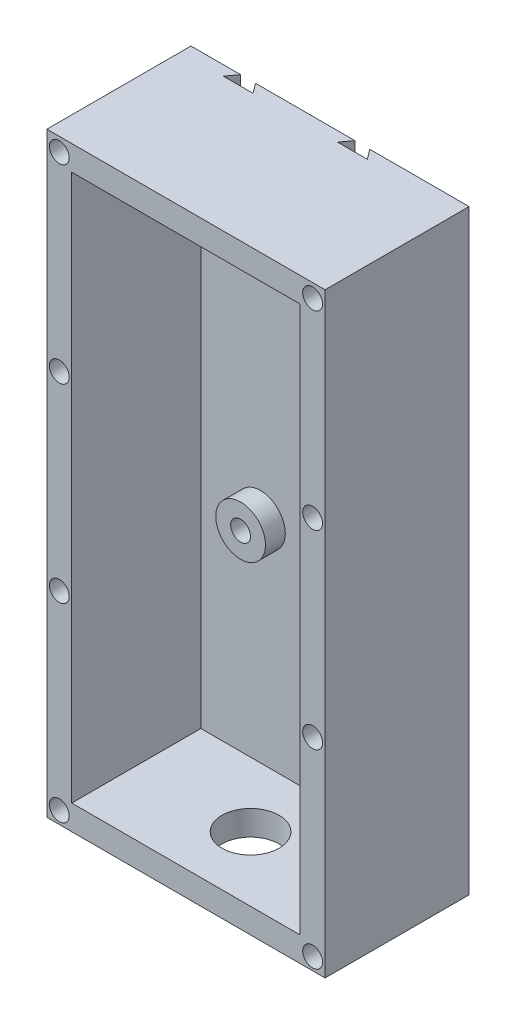
ISO-10303-21;
HEADER;
FILE_DESCRIPTION(('STEP AP214'),'2;1');
FILE_NAME('part.step','',(''),(''),'','','');
FILE_SCHEMA(('AUTOMOTIVE_DESIGN { 1 0 10303 214 1 1 1 1 }'));
ENDSEC;
DATA;
#1=APPLICATION_CONTEXT('core data for automotive mechanical design processes');
#2=APPLICATION_PROTOCOL_DEFINITION('international standard','automotive_design',2000,#1);
#3=PRODUCT_CONTEXT('',#1,'mechanical');
#4=PRODUCT('Part','Part','',(#3));
#5=PRODUCT_RELATED_PRODUCT_CATEGORY('part','',(#4));
#6=PRODUCT_DEFINITION_FORMATION('','',#4);
#7=PRODUCT_DEFINITION_CONTEXT('part definition',#1,'design');
#8=PRODUCT_DEFINITION('design','',#6,#7);
#9=PRODUCT_DEFINITION_SHAPE('','',#8);
#10=(LENGTH_UNIT() NAMED_UNIT(*) SI_UNIT(.MILLI.,.METRE.));
#11=(NAMED_UNIT(*) PLANE_ANGLE_UNIT() SI_UNIT($,.RADIAN.));
#12=(NAMED_UNIT(*) SI_UNIT($,.STERADIAN.) SOLID_ANGLE_UNIT());
#13=UNCERTAINTY_MEASURE_WITH_UNIT(LENGTH_MEASURE(1.E-05),#10,'distance_accuracy_value','');
#14=(GEOMETRIC_REPRESENTATION_CONTEXT(3) GLOBAL_UNCERTAINTY_ASSIGNED_CONTEXT((#13)) GLOBAL_UNIT_ASSIGNED_CONTEXT((#10,
#11,#12)) REPRESENTATION_CONTEXT('',''));
#15=CARTESIAN_POINT('',(0.,0.,0.));
#16=DIRECTION('',(0.,0.,1.));
#17=DIRECTION('',(1.,0.,0.));
#18=AXIS2_PLACEMENT_3D('',#15,#16,#17);
#19=CARTESIAN_POINT('',(0.,0.,0.));
#20=DIRECTION('',(0.,0.,1.));
#21=DIRECTION('',(1.,0.,0.));
#22=AXIS2_PLACEMENT_3D('',#19,#20,#21);
#23=PLANE('',#22);
#24=DIRECTION('',(1.,0.,0.));
#25=VECTOR('',#24,1.);
#26=CARTESIAN_POINT('',(-114.,-13.,0.));
#27=LINE('',#26,#25);
#28=CARTESIAN_POINT('',(-101.,-13.,0.));
#29=VERTEX_POINT('',#28);
#30=CARTESIAN_POINT('',(-81.,-13.,0.));
#31=VERTEX_POINT('',#30);
#32=EDGE_CURVE('E169',#29,#31,#27,.T.);
#33=ORIENTED_EDGE('',*,*,#32,.F.);
#34=DIRECTION('',(0.,1.,0.));
#35=VECTOR('',#34,1.);
#36=CARTESIAN_POINT('',(-101.,-13.,0.));
#37=LINE('',#36,#35);
#38=CARTESIAN_POINT('',(-101.,107.,0.));
#39=VERTEX_POINT('',#38);
#40=EDGE_CURVE('E276',#29,#39,#37,.T.);
#41=ORIENTED_EDGE('',*,*,#40,.T.);
#42=DIRECTION('',(-1.,0.,0.));
#43=VECTOR('',#42,1.);
#44=CARTESIAN_POINT('',(-114.,107.,0.));
#45=LINE('',#44,#43);
#46=CARTESIAN_POINT('',(-81.,107.,0.));
#47=VERTEX_POINT('',#46);
#48=EDGE_CURVE('E349',#47,#39,#45,.T.);
#49=ORIENTED_EDGE('',*,*,#48,.F.);
#50=DIRECTION('',(0.,1.,0.));
#51=VECTOR('',#50,1.);
#52=CARTESIAN_POINT('',(-81.,-13.,0.));
#53=LINE('',#52,#51);
#54=EDGE_CURVE('E55',#31,#47,#53,.T.);
#55=ORIENTED_EDGE('',*,*,#54,.F.);
#56=EDGE_LOOP('',(#33,#41,#49,#55));
#57=FACE_BOUND('',#56,.T.);
#58=ADVANCED_FACE('F32',(#57),#23,.F.);
#59=CARTESIAN_POINT('',(-78.,-13.,0.));
#60=VERTEX_POINT('',#59);
#61=CARTESIAN_POINT('',(-58.,-13.,0.));
#62=VERTEX_POINT('',#61);
#63=EDGE_CURVE('E171',#60,#62,#27,.T.);
#64=ORIENTED_EDGE('',*,*,#63,.F.);
#65=DIRECTION('',(0.,1.,0.));
#66=VECTOR('',#65,1.);
#67=CARTESIAN_POINT('',(-78.,-13.,0.));
#68=LINE('',#67,#66);
#69=CARTESIAN_POINT('',(-78.,107.,0.));
#70=VERTEX_POINT('',#69);
#71=EDGE_CURVE('E152',#60,#70,#68,.T.);
#72=ORIENTED_EDGE('',*,*,#71,.T.);
#73=CARTESIAN_POINT('',(-58.,107.,0.));
#74=VERTEX_POINT('',#73);
#75=EDGE_CURVE('E354',#74,#70,#45,.T.);
#76=ORIENTED_EDGE('',*,*,#75,.F.);
#77=DIRECTION('',(0.,1.,0.));
#78=VECTOR('',#77,1.);
#79=CARTESIAN_POINT('',(-58.,107.,0.));
#80=LINE('',#79,#78);
#81=EDGE_CURVE('E168',#62,#74,#80,.T.);
#82=ORIENTED_EDGE('',*,*,#81,.F.);
#83=EDGE_LOOP('',(#64,#72,#76,#82));
#84=FACE_BOUND('',#83,.T.);
#85=ADVANCED_FACE('F396',(#84),#23,.F.);
#86=CARTESIAN_POINT('',(0.,0.,3.));
#87=DIRECTION('',(0.,0.,1.));
#88=DIRECTION('',(1.,0.,0.));
#89=AXIS2_PLACEMENT_3D('',#86,#87,#88);
#90=PLANE('',#89);
#91=CARTESIAN_POINT('',(-75.,87.5,3.));
#92=DIRECTION('',(0.,0.,1.));
#93=DIRECTION('',(-1.,0.,0.));
#94=AXIS2_PLACEMENT_3D('',#91,#92,#93);
#95=CIRCLE('',#94,5.00000000000001);
#96=CARTESIAN_POINT('',(-80.,87.5,3.));
#97=VERTEX_POINT('',#96);
#98=EDGE_CURVE('E257',#97,#97,#95,.T.);
#99=ORIENTED_EDGE('',*,*,#98,.F.);
#100=EDGE_LOOP('',(#99));
#101=FACE_BOUND('',#100,.T.);
#102=CARTESIAN_POINT('',(-75.,34.5,3.));
#103=DIRECTION('',(0.,0.,1.));
#104=DIRECTION('',(-1.,0.,0.));
#105=AXIS2_PLACEMENT_3D('',#102,#103,#104);
#106=CIRCLE('',#105,5.00000000000001);
#107=CARTESIAN_POINT('',(-80.,34.5,3.));
#108=VERTEX_POINT('',#107);
#109=EDGE_CURVE('E248',#108,#108,#106,.T.);
#110=ORIENTED_EDGE('',*,*,#109,.F.);
#111=EDGE_LOOP('',(#110));
#112=FACE_BOUND('',#111,.T.);
#113=CARTESIAN_POINT('',(-97.,34.5,3.));
#114=DIRECTION('',(0.,0.,1.));
#115=DIRECTION('',(1.,0.,0.));
#116=AXIS2_PLACEMENT_3D('',#113,#114,#115);
#117=CIRCLE('',#116,5.00000000000001);
#118=CARTESIAN_POINT('',(-92.,34.5,3.));
#119=VERTEX_POINT('',#118);
#120=EDGE_CURVE('E239',#119,#119,#117,.T.);
#121=ORIENTED_EDGE('',*,*,#120,.F.);
#122=EDGE_LOOP('',(#121));
#123=FACE_BOUND('',#122,.T.);
#124=DIRECTION('',(0.,1.,0.));
#125=VECTOR('',#124,1.);
#126=CARTESIAN_POINT('',(-63.,102.,3.));
#127=LINE('',#126,#125);
#128=CARTESIAN_POINT('',(-63.,-8.,3.));
#129=VERTEX_POINT('',#128);
#130=CARTESIAN_POINT('',(-63.,102.,3.));
#131=VERTEX_POINT('',#130);
#132=EDGE_CURVE('E223',#129,#131,#127,.T.);
#133=ORIENTED_EDGE('',*,*,#132,.T.);
#134=DIRECTION('',(-1.,0.,0.));
#135=VECTOR('',#134,1.);
#136=CARTESIAN_POINT('',(-63.,102.,3.));
#137=LINE('',#136,#135);
#138=CARTESIAN_POINT('',(-109.,102.,3.));
#139=VERTEX_POINT('',#138);
#140=EDGE_CURVE('E221',#131,#139,#137,.T.);
#141=ORIENTED_EDGE('',*,*,#140,.T.);
#142=DIRECTION('',(0.,-1.,0.));
#143=VECTOR('',#142,1.);
#144=CARTESIAN_POINT('',(-109.,102.,3.));
#145=LINE('',#144,#143);
#146=CARTESIAN_POINT('',(-109.,-8.00000000000001,3.));
#147=VERTEX_POINT('',#146);
#148=EDGE_CURVE('E219',#139,#147,#145,.T.);
#149=ORIENTED_EDGE('',*,*,#148,.T.);
#150=DIRECTION('',(1.,0.,0.));
#151=VECTOR('',#150,1.);
#152=CARTESIAN_POINT('',(-63.,-8.,3.));
#153=LINE('',#152,#151);
#154=EDGE_CURVE('E216',#147,#129,#153,.T.);
#155=ORIENTED_EDGE('',*,*,#154,.T.);
#156=EDGE_LOOP('',(#133,#141,#149,#155));
#157=FACE_BOUND('',#156,.T.);
#158=CARTESIAN_POINT('',(-97.,87.5,3.));
#159=DIRECTION('',(0.,0.,1.));
#160=DIRECTION('',(1.,0.,0.));
#161=AXIS2_PLACEMENT_3D('',#158,#159,#160);
#162=CIRCLE('',#161,5.00000000000001);
#163=CARTESIAN_POINT('',(-92.,87.5,3.));
#164=VERTEX_POINT('',#163);
#165=EDGE_CURVE('E183',#164,#164,#162,.T.);
#166=ORIENTED_EDGE('',*,*,#165,.F.);
#167=EDGE_LOOP('',(#166));
#168=FACE_BOUND('',#167,.T.);
#169=ADVANCED_FACE('F418',(#101,#112,#123,#157,#168),#90,.T.);
#170=CARTESIAN_POINT('',(-97.,87.5,7.));
#171=DIRECTION('',(0.,0.,1.));
#172=DIRECTION('',(1.,0.,0.));
#173=AXIS2_PLACEMENT_3D('',#170,#171,#172);
#174=PLANE('',#173);
#175=CARTESIAN_POINT('',(-97.,87.5,7.));
#176=DIRECTION('',(0.,0.,1.));
#177=DIRECTION('',(1.,0.,0.));
#178=AXIS2_PLACEMENT_3D('',#175,#176,#177);
#179=CIRCLE('',#178,5.00000000000001);
#180=CARTESIAN_POINT('',(-92.,87.5,7.));
#181=VERTEX_POINT('',#180);
#182=EDGE_CURVE('E179',#181,#181,#179,.T.);
#183=ORIENTED_EDGE('',*,*,#182,.T.);
#184=EDGE_LOOP('',(#183));
#185=FACE_BOUND('',#184,.T.);
#186=CARTESIAN_POINT('',(-97.,87.5,7.));
#187=DIRECTION('',(0.,0.,1.));
#188=DIRECTION('',(1.,0.,0.));
#189=AXIS2_PLACEMENT_3D('',#186,#187,#188);
#190=CIRCLE('',#189,2.);
#191=CARTESIAN_POINT('',(-95.,87.5,7.));
#192=VERTEX_POINT('',#191);
#193=EDGE_CURVE('E187',#192,#192,#190,.T.);
#194=ORIENTED_EDGE('',*,*,#193,.F.);
#195=EDGE_LOOP('',(#194));
#196=FACE_BOUND('',#195,.T.);
#197=ADVANCED_FACE('F461',(#185,#196),#174,.T.);
#198=CARTESIAN_POINT('',(-97.,87.5,7.));
#199=DIRECTION('',(0.,0.,-1.));
#200=DIRECTION('',(-1.,0.,0.));
#201=AXIS2_PLACEMENT_3D('',#198,#199,#200);
#202=CYLINDRICAL_SURFACE('',#201,5.00000000000001);
#203=ORIENTED_EDGE('',*,*,#182,.F.);
#204=EDGE_LOOP('',(#203));
#205=FACE_BOUND('',#204,.T.);
#206=ORIENTED_EDGE('',*,*,#165,.T.);
#207=EDGE_LOOP('',(#206));
#208=FACE_BOUND('',#207,.T.);
#209=ADVANCED_FACE('F459',(#205,#208),#202,.T.);
#210=CARTESIAN_POINT('',(-97.,87.5,7.));
#211=DIRECTION('',(0.,0.,-1.));
#212=DIRECTION('',(-1.,0.,0.));
#213=AXIS2_PLACEMENT_3D('',#210,#211,#212);
#214=CYLINDRICAL_SURFACE('',#213,2.);
#215=ORIENTED_EDGE('',*,*,#193,.T.);
#216=EDGE_LOOP('',(#215));
#217=FACE_BOUND('',#216,.T.);
#218=CARTESIAN_POINT('',(-97.,87.5,3.));
#219=DIRECTION('',(0.,0.,1.));
#220=DIRECTION('',(1.,0.,0.));
#221=AXIS2_PLACEMENT_3D('',#218,#219,#220);
#222=CIRCLE('',#221,2.);
#223=CARTESIAN_POINT('',(-95.,87.5,3.));
#224=VERTEX_POINT('',#223);
#225=EDGE_CURVE('E366',#224,#224,#222,.F.);
#226=ORIENTED_EDGE('',*,*,#225,.T.);
#227=EDGE_LOOP('',(#226));
#228=FACE_BOUND('',#227,.T.);
#229=ADVANCED_FACE('F456',(#217,#228),#214,.F.);
#230=ORIENTED_EDGE('',*,*,#225,.F.);
#231=EDGE_LOOP('',(#230));
#232=FACE_BOUND('',#231,.T.);
#233=ADVANCED_FACE('F454',(#232),#90,.T.);
#234=CARTESIAN_POINT('',(0.,0.,29.));
#235=DIRECTION('',(0.,0.,-1.));
#236=DIRECTION('',(-1.,0.,0.));
#237=AXIS2_PLACEMENT_3D('',#234,#235,#236);
#238=PLANE('',#237);
#239=CARTESIAN_POINT('',(-111.5,104.25,29.));
#240=DIRECTION('',(0.,0.,1.));
#241=DIRECTION('',(1.,0.,0.));
#242=AXIS2_PLACEMENT_3D('',#239,#240,#241);
#243=CIRCLE('',#242,2.);
#244=CARTESIAN_POINT('',(-109.5,104.25,29.));
#245=VERTEX_POINT('',#244);
#246=EDGE_CURVE('E272',#245,#245,#243,.T.);
#247=ORIENTED_EDGE('',*,*,#246,.F.);
#248=EDGE_LOOP('',(#247));
#249=FACE_BOUND('',#248,.T.);
#250=CARTESIAN_POINT('',(-111.5,66.,29.));
#251=DIRECTION('',(0.,0.,1.));
#252=DIRECTION('',(1.,0.,0.));
#253=AXIS2_PLACEMENT_3D('',#250,#251,#252);
#254=CIRCLE('',#253,2.);
#255=CARTESIAN_POINT('',(-109.5,66.,29.));
#256=VERTEX_POINT('',#255);
#257=EDGE_CURVE('E279',#256,#256,#254,.T.);
#258=ORIENTED_EDGE('',*,*,#257,.F.);
#259=EDGE_LOOP('',(#258));
#260=FACE_BOUND('',#259,.T.);
#261=CARTESIAN_POINT('',(-111.5,27.75,29.));
#262=DIRECTION('',(0.,0.,1.));
#263=DIRECTION('',(1.,0.,0.));
#264=AXIS2_PLACEMENT_3D('',#261,#262,#263);
#265=CIRCLE('',#264,2.);
#266=CARTESIAN_POINT('',(-109.5,27.75,29.));
#267=VERTEX_POINT('',#266);
#268=EDGE_CURVE('E285',#267,#267,#265,.T.);
#269=ORIENTED_EDGE('',*,*,#268,.F.);
#270=EDGE_LOOP('',(#269));
#271=FACE_BOUND('',#270,.T.);
#272=CARTESIAN_POINT('',(-60.5000000000004,104.25,29.));
#273=DIRECTION('',(0.,0.,1.));
#274=DIRECTION('',(1.,0.,0.));
#275=AXIS2_PLACEMENT_3D('',#272,#273,#274);
#276=CIRCLE('',#275,2.);
#277=CARTESIAN_POINT('',(-58.5000000000004,104.25,29.));
#278=VERTEX_POINT('',#277);
#279=EDGE_CURVE('E291',#278,#278,#276,.T.);
#280=ORIENTED_EDGE('',*,*,#279,.F.);
#281=EDGE_LOOP('',(#280));
#282=FACE_BOUND('',#281,.T.);
#283=CARTESIAN_POINT('',(-60.5000000000003,66.,29.));
#284=DIRECTION('',(0.,0.,1.));
#285=DIRECTION('',(1.,0.,0.));
#286=AXIS2_PLACEMENT_3D('',#283,#284,#285);
#287=CIRCLE('',#286,2.);
#288=CARTESIAN_POINT('',(-58.5000000000003,66.,29.));
#289=VERTEX_POINT('',#288);
#290=EDGE_CURVE('E297',#289,#289,#287,.T.);
#291=ORIENTED_EDGE('',*,*,#290,.F.);
#292=EDGE_LOOP('',(#291));
#293=FACE_BOUND('',#292,.T.);
#294=CARTESIAN_POINT('',(-60.5000000000001,27.75,29.));
#295=DIRECTION('',(0.,0.,1.));
#296=DIRECTION('',(1.,0.,0.));
#297=AXIS2_PLACEMENT_3D('',#294,#295,#296);
#298=CIRCLE('',#297,2.);
#299=CARTESIAN_POINT('',(-58.5000000000001,27.75,29.));
#300=VERTEX_POINT('',#299);
#301=EDGE_CURVE('E303',#300,#300,#298,.T.);
#302=ORIENTED_EDGE('',*,*,#301,.F.);
#303=EDGE_LOOP('',(#302));
#304=FACE_BOUND('',#303,.T.);
#305=CARTESIAN_POINT('',(-60.5,-10.5,29.));
#306=DIRECTION('',(0.,0.,1.));
#307=DIRECTION('',(1.,0.,0.));
#308=AXIS2_PLACEMENT_3D('',#305,#306,#307);
#309=CIRCLE('',#308,2.);
#310=CARTESIAN_POINT('',(-58.5,-10.5,29.));
#311=VERTEX_POINT('',#310);
#312=EDGE_CURVE('E309',#311,#311,#309,.T.);
#313=ORIENTED_EDGE('',*,*,#312,.F.);
#314=EDGE_LOOP('',(#313));
#315=FACE_BOUND('',#314,.T.);
#316=CARTESIAN_POINT('',(-111.5,-10.5,29.));
#317=DIRECTION('',(0.,0.,1.));
#318=DIRECTION('',(1.,0.,0.));
#319=AXIS2_PLACEMENT_3D('',#316,#317,#318);
#320=CIRCLE('',#319,2.);
#321=CARTESIAN_POINT('',(-109.5,-10.5,29.));
#322=VERTEX_POINT('',#321);
#323=EDGE_CURVE('E266',#322,#322,#320,.T.);
#324=ORIENTED_EDGE('',*,*,#323,.F.);
#325=EDGE_LOOP('',(#324));
#326=FACE_BOUND('',#325,.T.);
#327=DIRECTION('',(0.,1.,0.));
#328=VECTOR('',#327,1.);
#329=CARTESIAN_POINT('',(-58.,107.,29.));
#330=LINE('',#329,#328);
#331=CARTESIAN_POINT('',(-58.,-13.,29.));
#332=VERTEX_POINT('',#331);
#333=CARTESIAN_POINT('',(-58.,107.,29.));
#334=VERTEX_POINT('',#333);
#335=EDGE_CURVE('E200',#332,#334,#330,.T.);
#336=ORIENTED_EDGE('',*,*,#335,.T.);
#337=DIRECTION('',(-1.,0.,0.));
#338=VECTOR('',#337,1.);
#339=CARTESIAN_POINT('',(-58.,107.,29.));
#340=LINE('',#339,#338);
#341=CARTESIAN_POINT('',(-114.,107.,29.));
#342=VERTEX_POINT('',#341);
#343=EDGE_CURVE('E197',#334,#342,#340,.T.);
#344=ORIENTED_EDGE('',*,*,#343,.T.);
#345=DIRECTION('',(0.,-1.,0.));
#346=VECTOR('',#345,1.);
#347=CARTESIAN_POINT('',(-114.,107.,29.));
#348=LINE('',#347,#346);
#349=CARTESIAN_POINT('',(-114.,-13.,29.));
#350=VERTEX_POINT('',#349);
#351=EDGE_CURVE('E194',#342,#350,#348,.T.);
#352=ORIENTED_EDGE('',*,*,#351,.T.);
#353=DIRECTION('',(1.,0.,0.));
#354=VECTOR('',#353,1.);
#355=CARTESIAN_POINT('',(-58.,-13.,29.));
#356=LINE('',#355,#354);
#357=EDGE_CURVE('E191',#350,#332,#356,.T.);
#358=ORIENTED_EDGE('',*,*,#357,.T.);
#359=EDGE_LOOP('',(#336,#344,#352,#358));
#360=FACE_BOUND('',#359,.T.);
#361=DIRECTION('',(0.,1.,0.));
#362=VECTOR('',#361,1.);
#363=CARTESIAN_POINT('',(-63.,102.,29.));
#364=LINE('',#363,#362);
#365=CARTESIAN_POINT('',(-63.,-8.,29.));
#366=VERTEX_POINT('',#365);
#367=CARTESIAN_POINT('',(-63.,102.,29.));
#368=VERTEX_POINT('',#367);
#369=EDGE_CURVE('E218',#366,#368,#364,.T.);
#370=ORIENTED_EDGE('',*,*,#369,.F.);
#371=DIRECTION('',(1.,0.,0.));
#372=VECTOR('',#371,1.);
#373=CARTESIAN_POINT('',(-63.,-8.,29.));
#374=LINE('',#373,#372);
#375=CARTESIAN_POINT('',(-109.,-8.00000000000001,29.));
#376=VERTEX_POINT('',#375);
#377=EDGE_CURVE('E215',#376,#366,#374,.T.);
#378=ORIENTED_EDGE('',*,*,#377,.F.);
#379=DIRECTION('',(0.,-1.,0.));
#380=VECTOR('',#379,1.);
#381=CARTESIAN_POINT('',(-109.,102.,29.));
#382=LINE('',#381,#380);
#383=CARTESIAN_POINT('',(-109.,102.,29.));
#384=VERTEX_POINT('',#383);
#385=EDGE_CURVE('E227',#384,#376,#382,.T.);
#386=ORIENTED_EDGE('',*,*,#385,.F.);
#387=DIRECTION('',(-1.,0.,0.));
#388=VECTOR('',#387,1.);
#389=CARTESIAN_POINT('',(-63.,102.,29.));
#390=LINE('',#389,#388);
#391=EDGE_CURVE('E230',#368,#384,#390,.T.);
#392=ORIENTED_EDGE('',*,*,#391,.F.);
#393=EDGE_LOOP('',(#370,#378,#386,#392));
#394=FACE_BOUND('',#393,.T.);
#395=ADVANCED_FACE('F388',(#249,#260,#271,#282,#293,#304,#315,#326,#360,#394),#238,.F.);
#396=CARTESIAN_POINT('',(-63.,102.,29.));
#397=DIRECTION('',(-1.,0.,0.));
#398=DIRECTION('',(0.,-1.,0.));
#399=AXIS2_PLACEMENT_3D('',#396,#397,#398);
#400=PLANE('',#399);
#401=ORIENTED_EDGE('',*,*,#132,.F.);
#402=DIRECTION('',(0.,0.,-1.));
#403=VECTOR('',#402,1.);
#404=CARTESIAN_POINT('',(-63.,-8.,29.));
#405=LINE('',#404,#403);
#406=EDGE_CURVE('E212',#366,#129,#405,.T.);
#407=ORIENTED_EDGE('',*,*,#406,.F.);
#408=ORIENTED_EDGE('',*,*,#369,.T.);
#409=DIRECTION('',(0.,0.,-1.));
#410=VECTOR('',#409,1.);
#411=CARTESIAN_POINT('',(-63.,102.,29.));
#412=LINE('',#411,#410);
#413=EDGE_CURVE('E203',#368,#131,#412,.T.);
#414=ORIENTED_EDGE('',*,*,#413,.T.);
#415=EDGE_LOOP('',(#401,#407,#408,#414));
#416=FACE_BOUND('',#415,.T.);
#417=ADVANCED_FACE('F447',(#416),#400,.T.);
#418=CARTESIAN_POINT('',(-63.,102.,29.));
#419=DIRECTION('',(0.,-1.,0.));
#420=DIRECTION('',(0.,0.,-1.));
#421=AXIS2_PLACEMENT_3D('',#418,#419,#420);
#422=PLANE('',#421);
#423=ORIENTED_EDGE('',*,*,#140,.F.);
#424=ORIENTED_EDGE('',*,*,#413,.F.);
#425=ORIENTED_EDGE('',*,*,#391,.T.);
#426=DIRECTION('',(0.,0.,-1.));
#427=VECTOR('',#426,1.);
#428=CARTESIAN_POINT('',(-109.,102.,29.));
#429=LINE('',#428,#427);
#430=EDGE_CURVE('E206',#384,#139,#429,.T.);
#431=ORIENTED_EDGE('',*,*,#430,.T.);
#432=EDGE_LOOP('',(#423,#424,#425,#431));
#433=FACE_BOUND('',#432,.T.);
#434=ADVANCED_FACE('F443',(#433),#422,.T.);
#435=CARTESIAN_POINT('',(-109.,102.,29.));
#436=DIRECTION('',(1.,0.,0.));
#437=DIRECTION('',(0.,1.,0.));
#438=AXIS2_PLACEMENT_3D('',#435,#436,#437);
#439=PLANE('',#438);
#440=ORIENTED_EDGE('',*,*,#148,.F.);
#441=ORIENTED_EDGE('',*,*,#430,.F.);
#442=ORIENTED_EDGE('',*,*,#385,.T.);
#443=DIRECTION('',(0.,0.,-1.));
#444=VECTOR('',#443,1.);
#445=CARTESIAN_POINT('',(-109.,-8.00000000000001,29.));
#446=LINE('',#445,#444);
#447=EDGE_CURVE('E209',#376,#147,#446,.T.);
#448=ORIENTED_EDGE('',*,*,#447,.T.);
#449=EDGE_LOOP('',(#440,#441,#442,#448));
#450=FACE_BOUND('',#449,.T.);
#451=ADVANCED_FACE('F433',(#450),#439,.T.);
#452=CARTESIAN_POINT('',(-63.,-8.,29.));
#453=DIRECTION('',(0.,1.,0.));
#454=DIRECTION('',(-1.,0.,0.));
#455=AXIS2_PLACEMENT_3D('',#452,#453,#454);
#456=PLANE('',#455);
#457=CARTESIAN_POINT('',(-86.,-8.00000000000001,16.));
#458=DIRECTION('',(0.,1.,0.));
#459=DIRECTION('',(-1.,0.,0.));
#460=AXIS2_PLACEMENT_3D('',#457,#458,#459);
#461=CIRCLE('',#460,5.75);
#462=CARTESIAN_POINT('',(-91.75,-8.00000000000001,16.));
#463=VERTEX_POINT('',#462);
#464=EDGE_CURVE('E225',#463,#463,#461,.F.);
#465=ORIENTED_EDGE('',*,*,#464,.T.);
#466=EDGE_LOOP('',(#465));
#467=FACE_BOUND('',#466,.T.);
#468=ORIENTED_EDGE('',*,*,#154,.F.);
#469=ORIENTED_EDGE('',*,*,#447,.F.);
#470=ORIENTED_EDGE('',*,*,#377,.T.);
#471=ORIENTED_EDGE('',*,*,#406,.T.);
#472=EDGE_LOOP('',(#468,#469,#470,#471));
#473=FACE_BOUND('',#472,.T.);
#474=ADVANCED_FACE('F427',(#467,#473),#456,.T.);
#475=CARTESIAN_POINT('',(-86.,8.26345596729059,16.));
#476=DIRECTION('',(0.,-1.,0.));
#477=DIRECTION('',(0.,0.,-1.));
#478=AXIS2_PLACEMENT_3D('',#475,#476,#477);
#479=CYLINDRICAL_SURFACE('',#478,5.75);
#480=CARTESIAN_POINT('',(-86.,-13.,16.));
#481=DIRECTION('',(0.,-1.,0.));
#482=DIRECTION('',(0.,0.,-1.));
#483=AXIS2_PLACEMENT_3D('',#480,#481,#482);
#484=CIRCLE('',#483,5.75);
#485=CARTESIAN_POINT('',(-86.,-13.,10.25));
#486=VERTEX_POINT('',#485);
#487=EDGE_CURVE('E235',#486,#486,#484,.T.);
#488=ORIENTED_EDGE('',*,*,#487,.T.);
#489=EDGE_LOOP('',(#488));
#490=FACE_BOUND('',#489,.T.);
#491=ORIENTED_EDGE('',*,*,#464,.F.);
#492=EDGE_LOOP('',(#491));
#493=FACE_BOUND('',#492,.T.);
#494=ADVANCED_FACE('F422',(#490,#493),#479,.F.);
#495=CARTESIAN_POINT('',(-104.,107.,0.));
#496=VERTEX_POINT('',#495);
#497=CARTESIAN_POINT('',(-114.,107.,0.));
#498=VERTEX_POINT('',#497);
#499=EDGE_CURVE('E160',#496,#498,#45,.T.);
#500=ORIENTED_EDGE('',*,*,#499,.F.);
#501=DIRECTION('',(0.,1.,0.));
#502=VECTOR('',#501,1.);
#503=CARTESIAN_POINT('',(-104.,-13.,0.));
#504=LINE('',#503,#502);
#505=CARTESIAN_POINT('',(-104.,-13.,0.));
#506=VERTEX_POINT('',#505);
#507=EDGE_CURVE('E47',#506,#496,#504,.T.);
#508=ORIENTED_EDGE('',*,*,#507,.F.);
#509=CARTESIAN_POINT('',(-114.,-13.,0.));
#510=VERTEX_POINT('',#509);
#511=EDGE_CURVE('E158',#510,#506,#27,.T.);
#512=ORIENTED_EDGE('',*,*,#511,.F.);
#513=DIRECTION('',(0.,-1.,0.));
#514=VECTOR('',#513,1.);
#515=CARTESIAN_POINT('',(-114.,107.,0.));
#516=LINE('',#515,#514);
#517=EDGE_CURVE('E175',#498,#510,#516,.T.);
#518=ORIENTED_EDGE('',*,*,#517,.F.);
#519=EDGE_LOOP('',(#500,#508,#512,#518));
#520=FACE_BOUND('',#519,.T.);
#521=ADVANCED_FACE('F156',(#520),#23,.F.);
#522=CARTESIAN_POINT('',(-114.,-13.,3.));
#523=DIRECTION('',(0.,1.,0.));
#524=DIRECTION('',(-1.,0.,0.));
#525=AXIS2_PLACEMENT_3D('',#522,#523,#524);
#526=PLANE('',#525);
#527=DIRECTION('',(1.,0.,0.));
#528=VECTOR('',#527,1.);
#529=CARTESIAN_POINT('',(-105.5,-13.,2.));
#530=LINE('',#529,#528);
#531=CARTESIAN_POINT('',(-105.5,-13.,2.));
#532=VERTEX_POINT('',#531);
#533=CARTESIAN_POINT('',(-99.5,-13.,2.));
#534=VERTEX_POINT('',#533);
#535=EDGE_CURVE('E151',#532,#534,#530,.T.);
#536=ORIENTED_EDGE('',*,*,#535,.T.);
#537=DIRECTION('',(-0.599999999999997,0.,-0.800000000000002));
#538=VECTOR('',#537,1.);
#539=CARTESIAN_POINT('',(-99.5,-13.,2.));
#540=LINE('',#539,#538);
#541=EDGE_CURVE('E161',#534,#29,#540,.T.);
#542=ORIENTED_EDGE('',*,*,#541,.T.);
#543=ORIENTED_EDGE('',*,*,#32,.T.);
#544=DIRECTION('',(-0.599999999999996,0.,0.800000000000003));
#545=VECTOR('',#544,1.);
#546=CARTESIAN_POINT('',(-81.,-13.,0.));
#547=LINE('',#546,#545);
#548=CARTESIAN_POINT('',(-82.5,-13.,2.));
#549=VERTEX_POINT('',#548);
#550=EDGE_CURVE('E328',#31,#549,#547,.T.);
#551=ORIENTED_EDGE('',*,*,#550,.T.);
#552=DIRECTION('',(1.,0.,0.));
#553=VECTOR('',#552,1.);
#554=CARTESIAN_POINT('',(-82.5,-13.,2.));
#555=LINE('',#554,#553);
#556=CARTESIAN_POINT('',(-76.5,-13.,2.));
#557=VERTEX_POINT('',#556);
#558=EDGE_CURVE('E325',#549,#557,#555,.T.);
#559=ORIENTED_EDGE('',*,*,#558,.T.);
#560=DIRECTION('',(-0.600000000000001,0.,-0.799999999999999));
#561=VECTOR('',#560,1.);
#562=CARTESIAN_POINT('',(-76.5,-13.,2.));
#563=LINE('',#562,#561);
#564=EDGE_CURVE('E316',#557,#60,#563,.T.);
#565=ORIENTED_EDGE('',*,*,#564,.T.);
#566=ORIENTED_EDGE('',*,*,#63,.T.);
#567=DIRECTION('',(0.,0.,-1.));
#568=VECTOR('',#567,1.);
#569=CARTESIAN_POINT('',(-58.,-13.,3.));
#570=LINE('',#569,#568);
#571=EDGE_CURVE('E363',#332,#62,#570,.T.);
#572=ORIENTED_EDGE('',*,*,#571,.F.);
#573=ORIENTED_EDGE('',*,*,#357,.F.);
#574=DIRECTION('',(0.,0.,-1.));
#575=VECTOR('',#574,1.);
#576=CARTESIAN_POINT('',(-114.,-13.,3.));
#577=LINE('',#576,#575);
#578=EDGE_CURVE('E166',#350,#510,#577,.T.);
#579=ORIENTED_EDGE('',*,*,#578,.T.);
#580=ORIENTED_EDGE('',*,*,#511,.T.);
#581=DIRECTION('',(-0.599999999999999,0.,0.8));
#582=VECTOR('',#581,1.);
#583=CARTESIAN_POINT('',(-104.,-13.,0.));
#584=LINE('',#583,#582);
#585=EDGE_CURVE('E143',#506,#532,#584,.T.);
#586=ORIENTED_EDGE('',*,*,#585,.T.);
#587=EDGE_LOOP('',(#536,#542,#543,#551,#559,#565,#566,#572,#573,#579,#580,#586));
#588=FACE_BOUND('',#587,.T.);
#589=ORIENTED_EDGE('',*,*,#487,.F.);
#590=EDGE_LOOP('',(#589));
#591=FACE_BOUND('',#590,.T.);
#592=ADVANCED_FACE('F163',(#588,#591),#526,.F.);
#593=CARTESIAN_POINT('',(-114.,107.,3.));
#594=DIRECTION('',(1.,0.,0.));
#595=DIRECTION('',(0.,1.,0.));
#596=AXIS2_PLACEMENT_3D('',#593,#594,#595);
#597=PLANE('',#596);
#598=ORIENTED_EDGE('',*,*,#517,.T.);
#599=ORIENTED_EDGE('',*,*,#578,.F.);
#600=ORIENTED_EDGE('',*,*,#351,.F.);
#601=DIRECTION('',(0.,0.,-1.));
#602=VECTOR('',#601,1.);
#603=CARTESIAN_POINT('',(-114.,107.,3.));
#604=LINE('',#603,#602);
#605=EDGE_CURVE('E357',#342,#498,#604,.T.);
#606=ORIENTED_EDGE('',*,*,#605,.T.);
#607=EDGE_LOOP('',(#598,#599,#600,#606));
#608=FACE_BOUND('',#607,.T.);
#609=ADVANCED_FACE('F34',(#608),#597,.F.);
#610=CARTESIAN_POINT('',(-114.,107.,3.));
#611=DIRECTION('',(0.,-1.,0.));
#612=DIRECTION('',(0.,0.,-1.));
#613=AXIS2_PLACEMENT_3D('',#610,#611,#612);
#614=PLANE('',#613);
#615=ORIENTED_EDGE('',*,*,#48,.T.);
#616=DIRECTION('',(0.599999999999997,0.,0.800000000000002));
#617=VECTOR('',#616,1.);
#618=CARTESIAN_POINT('',(-104.24,107.,-4.31999999999998));
#619=LINE('',#618,#617);
#620=CARTESIAN_POINT('',(-99.5,107.,2.));
#621=VERTEX_POINT('',#620);
#622=EDGE_CURVE('E11',#39,#621,#619,.T.);
#623=ORIENTED_EDGE('',*,*,#622,.T.);
#624=DIRECTION('',(-1.,0.,0.));
#625=VECTOR('',#624,1.);
#626=CARTESIAN_POINT('',(-114.,107.,2.));
#627=LINE('',#626,#625);
#628=CARTESIAN_POINT('',(-105.5,107.,2.));
#629=VERTEX_POINT('',#628);
#630=EDGE_CURVE('E40',#621,#629,#627,.T.);
#631=ORIENTED_EDGE('',*,*,#630,.T.);
#632=DIRECTION('',(0.599999999999999,0.,-0.8));
#633=VECTOR('',#632,1.);
#634=CARTESIAN_POINT('',(-109.04,107.,6.72));
#635=LINE('',#634,#633);
#636=EDGE_CURVE('E384',#629,#496,#635,.T.);
#637=ORIENTED_EDGE('',*,*,#636,.T.);
#638=ORIENTED_EDGE('',*,*,#499,.T.);
#639=ORIENTED_EDGE('',*,*,#605,.F.);
#640=ORIENTED_EDGE('',*,*,#343,.F.);
#641=DIRECTION('',(0.,0.,-1.));
#642=VECTOR('',#641,1.);
#643=CARTESIAN_POINT('',(-58.,107.,3.));
#644=LINE('',#643,#642);
#645=EDGE_CURVE('E360',#334,#74,#644,.T.);
#646=ORIENTED_EDGE('',*,*,#645,.T.);
#647=ORIENTED_EDGE('',*,*,#75,.T.);
#648=DIRECTION('',(0.600000000000001,0.,0.799999999999999));
#649=VECTOR('',#648,1.);
#650=CARTESIAN_POINT('',(-89.5200000000001,107.,-15.36));
#651=LINE('',#650,#649);
#652=CARTESIAN_POINT('',(-76.5,107.,2.));
#653=VERTEX_POINT('',#652);
#654=EDGE_CURVE('E381',#70,#653,#651,.T.);
#655=ORIENTED_EDGE('',*,*,#654,.T.);
#656=DIRECTION('',(-1.,0.,0.));
#657=VECTOR('',#656,1.);
#658=CARTESIAN_POINT('',(-114.,107.,2.));
#659=LINE('',#658,#657);
#660=CARTESIAN_POINT('',(-82.5,107.,2.));
#661=VERTEX_POINT('',#660);
#662=EDGE_CURVE('E379',#653,#661,#659,.T.);
#663=ORIENTED_EDGE('',*,*,#662,.T.);
#664=DIRECTION('',(0.599999999999996,0.,-0.800000000000003));
#665=VECTOR('',#664,1.);
#666=CARTESIAN_POINT('',(-94.3199999999999,107.,17.7599999999999));
#667=LINE('',#666,#665);
#668=EDGE_CURVE('E353',#661,#47,#667,.T.);
#669=ORIENTED_EDGE('',*,*,#668,.T.);
#670=EDGE_LOOP('',(#615,#623,#631,#637,#638,#639,#640,#646,#647,#655,#663,#669));
#671=FACE_BOUND('',#670,.T.);
#672=ADVANCED_FACE('F351',(#671),#614,.F.);
#673=CARTESIAN_POINT('',(-58.,107.,3.));
#674=DIRECTION('',(-1.,0.,0.));
#675=DIRECTION('',(0.,-1.,0.));
#676=AXIS2_PLACEMENT_3D('',#673,#674,#675);
#677=PLANE('',#676);
#678=ORIENTED_EDGE('',*,*,#81,.T.);
#679=ORIENTED_EDGE('',*,*,#645,.F.);
#680=ORIENTED_EDGE('',*,*,#335,.F.);
#681=ORIENTED_EDGE('',*,*,#571,.T.);
#682=EDGE_LOOP('',(#678,#679,#680,#681));
#683=FACE_BOUND('',#682,.T.);
#684=ADVANCED_FACE('F393',(#683),#677,.F.);
#685=CARTESIAN_POINT('',(-97.,34.5,7.));
#686=DIRECTION('',(0.,0.,1.));
#687=DIRECTION('',(1.,0.,0.));
#688=AXIS2_PLACEMENT_3D('',#685,#686,#687);
#689=PLANE('',#688);
#690=CARTESIAN_POINT('',(-97.,34.5,7.));
#691=DIRECTION('',(0.,0.,1.));
#692=DIRECTION('',(1.,0.,0.));
#693=AXIS2_PLACEMENT_3D('',#690,#691,#692);
#694=CIRCLE('',#693,5.00000000000001);
#695=CARTESIAN_POINT('',(-92.,34.5,7.));
#696=VERTEX_POINT('',#695);
#697=EDGE_CURVE('E238',#696,#696,#694,.T.);
#698=ORIENTED_EDGE('',*,*,#697,.T.);
#699=EDGE_LOOP('',(#698));
#700=FACE_BOUND('',#699,.T.);
#701=CARTESIAN_POINT('',(-97.,34.5,7.));
#702=DIRECTION('',(0.,0.,1.));
#703=DIRECTION('',(1.,0.,0.));
#704=AXIS2_PLACEMENT_3D('',#701,#702,#703);
#705=CIRCLE('',#704,2.);
#706=CARTESIAN_POINT('',(-95.,34.5,7.));
#707=VERTEX_POINT('',#706);
#708=EDGE_CURVE('E242',#707,#707,#705,.T.);
#709=ORIENTED_EDGE('',*,*,#708,.F.);
#710=EDGE_LOOP('',(#709));
#711=FACE_BOUND('',#710,.T.);
#712=ADVANCED_FACE('F520',(#700,#711),#689,.T.);
#713=CARTESIAN_POINT('',(-97.,34.5,7.));
#714=DIRECTION('',(0.,0.,-1.));
#715=DIRECTION('',(-1.,0.,0.));
#716=AXIS2_PLACEMENT_3D('',#713,#714,#715);
#717=CYLINDRICAL_SURFACE('',#716,5.00000000000001);
#718=ORIENTED_EDGE('',*,*,#697,.F.);
#719=EDGE_LOOP('',(#718));
#720=FACE_BOUND('',#719,.T.);
#721=ORIENTED_EDGE('',*,*,#120,.T.);
#722=EDGE_LOOP('',(#721));
#723=FACE_BOUND('',#722,.T.);
#724=ADVANCED_FACE('F438',(#720,#723),#717,.T.);
#725=CARTESIAN_POINT('',(-97.,34.5,7.));
#726=DIRECTION('',(0.,0.,-1.));
#727=DIRECTION('',(-1.,0.,0.));
#728=AXIS2_PLACEMENT_3D('',#725,#726,#727);
#729=CYLINDRICAL_SURFACE('',#728,2.);
#730=ORIENTED_EDGE('',*,*,#708,.T.);
#731=EDGE_LOOP('',(#730));
#732=FACE_BOUND('',#731,.T.);
#733=CARTESIAN_POINT('',(-97.,34.5,3.));
#734=DIRECTION('',(0.,0.,1.));
#735=DIRECTION('',(1.,0.,0.));
#736=AXIS2_PLACEMENT_3D('',#733,#734,#735);
#737=CIRCLE('',#736,2.);
#738=CARTESIAN_POINT('',(-95.,34.5,3.));
#739=VERTEX_POINT('',#738);
#740=EDGE_CURVE('E369',#739,#739,#737,.F.);
#741=ORIENTED_EDGE('',*,*,#740,.T.);
#742=EDGE_LOOP('',(#741));
#743=FACE_BOUND('',#742,.T.);
#744=ADVANCED_FACE('F487',(#732,#743),#729,.F.);
#745=ORIENTED_EDGE('',*,*,#740,.F.);
#746=EDGE_LOOP('',(#745));
#747=FACE_BOUND('',#746,.T.);
#748=ADVANCED_FACE('F481',(#747),#90,.T.);
#749=CARTESIAN_POINT('',(-75.,34.5,7.));
#750=DIRECTION('',(0.,0.,-1.));
#751=DIRECTION('',(-1.,0.,0.));
#752=AXIS2_PLACEMENT_3D('',#749,#750,#751);
#753=PLANE('',#752);
#754=CARTESIAN_POINT('',(-75.,34.5,7.));
#755=DIRECTION('',(0.,0.,1.));
#756=DIRECTION('',(-1.,0.,0.));
#757=AXIS2_PLACEMENT_3D('',#754,#755,#756);
#758=CIRCLE('',#757,5.00000000000001);
#759=CARTESIAN_POINT('',(-80.,34.5,7.));
#760=VERTEX_POINT('',#759);
#761=EDGE_CURVE('E247',#760,#760,#758,.T.);
#762=ORIENTED_EDGE('',*,*,#761,.T.);
#763=EDGE_LOOP('',(#762));
#764=FACE_BOUND('',#763,.T.);
#765=CARTESIAN_POINT('',(-75.,34.5,7.));
#766=DIRECTION('',(0.,0.,1.));
#767=DIRECTION('',(-1.,0.,0.));
#768=AXIS2_PLACEMENT_3D('',#765,#766,#767);
#769=CIRCLE('',#768,2.);
#770=CARTESIAN_POINT('',(-77.,34.5,7.));
#771=VERTEX_POINT('',#770);
#772=EDGE_CURVE('E251',#771,#771,#769,.T.);
#773=ORIENTED_EDGE('',*,*,#772,.F.);
#774=EDGE_LOOP('',(#773));
#775=FACE_BOUND('',#774,.T.);
#776=ADVANCED_FACE('F486',(#764,#775),#753,.F.);
#777=CARTESIAN_POINT('',(-75.,34.5,7.));
#778=DIRECTION('',(0.,0.,-1.));
#779=DIRECTION('',(-1.,0.,0.));
#780=AXIS2_PLACEMENT_3D('',#777,#778,#779);
#781=CYLINDRICAL_SURFACE('',#780,5.00000000000001);
#782=ORIENTED_EDGE('',*,*,#761,.F.);
#783=EDGE_LOOP('',(#782));
#784=FACE_BOUND('',#783,.T.);
#785=ORIENTED_EDGE('',*,*,#109,.T.);
#786=EDGE_LOOP('',(#785));
#787=FACE_BOUND('',#786,.T.);
#788=ADVANCED_FACE('F493',(#784,#787),#781,.T.);
#789=CARTESIAN_POINT('',(-75.,34.5,7.));
#790=DIRECTION('',(0.,0.,-1.));
#791=DIRECTION('',(-1.,0.,0.));
#792=AXIS2_PLACEMENT_3D('',#789,#790,#791);
#793=CYLINDRICAL_SURFACE('',#792,2.);
#794=ORIENTED_EDGE('',*,*,#772,.T.);
#795=EDGE_LOOP('',(#794));
#796=FACE_BOUND('',#795,.T.);
#797=CARTESIAN_POINT('',(-75.,34.5,3.));
#798=DIRECTION('',(0.,0.,1.));
#799=DIRECTION('',(1.,0.,0.));
#800=AXIS2_PLACEMENT_3D('',#797,#798,#799);
#801=CIRCLE('',#800,2.);
#802=CARTESIAN_POINT('',(-73.,34.5,3.));
#803=VERTEX_POINT('',#802);
#804=EDGE_CURVE('E372',#803,#803,#801,.F.);
#805=ORIENTED_EDGE('',*,*,#804,.T.);
#806=EDGE_LOOP('',(#805));
#807=FACE_BOUND('',#806,.T.);
#808=ADVANCED_FACE('F501',(#796,#807),#793,.F.);
#809=ORIENTED_EDGE('',*,*,#804,.F.);
#810=EDGE_LOOP('',(#809));
#811=FACE_BOUND('',#810,.T.);
#812=ADVANCED_FACE('F478',(#811),#90,.T.);
#813=CARTESIAN_POINT('',(-75.,87.5,7.));
#814=DIRECTION('',(0.,0.,-1.));
#815=DIRECTION('',(-1.,0.,0.));
#816=AXIS2_PLACEMENT_3D('',#813,#814,#815);
#817=PLANE('',#816);
#818=CARTESIAN_POINT('',(-75.,87.5,7.));
#819=DIRECTION('',(0.,0.,1.));
#820=DIRECTION('',(-1.,0.,0.));
#821=AXIS2_PLACEMENT_3D('',#818,#819,#820);
#822=CIRCLE('',#821,5.00000000000001);
#823=CARTESIAN_POINT('',(-80.,87.5,7.));
#824=VERTEX_POINT('',#823);
#825=EDGE_CURVE('E256',#824,#824,#822,.T.);
#826=ORIENTED_EDGE('',*,*,#825,.T.);
#827=EDGE_LOOP('',(#826));
#828=FACE_BOUND('',#827,.T.);
#829=CARTESIAN_POINT('',(-75.,87.5,7.));
#830=DIRECTION('',(0.,0.,1.));
#831=DIRECTION('',(-1.,0.,0.));
#832=AXIS2_PLACEMENT_3D('',#829,#830,#831);
#833=CIRCLE('',#832,2.);
#834=CARTESIAN_POINT('',(-77.,87.5,7.));
#835=VERTEX_POINT('',#834);
#836=EDGE_CURVE('E260',#835,#835,#833,.T.);
#837=ORIENTED_EDGE('',*,*,#836,.F.);
#838=EDGE_LOOP('',(#837));
#839=FACE_BOUND('',#838,.T.);
#840=ADVANCED_FACE('F500',(#828,#839),#817,.F.);
#841=CARTESIAN_POINT('',(-75.,87.5,7.));
#842=DIRECTION('',(0.,0.,-1.));
#843=DIRECTION('',(-1.,0.,0.));
#844=AXIS2_PLACEMENT_3D('',#841,#842,#843);
#845=CYLINDRICAL_SURFACE('',#844,5.00000000000001);
#846=ORIENTED_EDGE('',*,*,#825,.F.);
#847=EDGE_LOOP('',(#846));
#848=FACE_BOUND('',#847,.T.);
#849=ORIENTED_EDGE('',*,*,#98,.T.);
#850=EDGE_LOOP('',(#849));
#851=FACE_BOUND('',#850,.T.);
#852=ADVANCED_FACE('F507',(#848,#851),#845,.T.);
#853=CARTESIAN_POINT('',(-75.,87.5,7.));
#854=DIRECTION('',(0.,0.,-1.));
#855=DIRECTION('',(-1.,0.,0.));
#856=AXIS2_PLACEMENT_3D('',#853,#854,#855);
#857=CYLINDRICAL_SURFACE('',#856,2.);
#858=ORIENTED_EDGE('',*,*,#836,.T.);
#859=EDGE_LOOP('',(#858));
#860=FACE_BOUND('',#859,.T.);
#861=CARTESIAN_POINT('',(-75.,87.5,3.));
#862=DIRECTION('',(0.,0.,1.));
#863=DIRECTION('',(1.,0.,0.));
#864=AXIS2_PLACEMENT_3D('',#861,#862,#863);
#865=CIRCLE('',#864,2.);
#866=CARTESIAN_POINT('',(-73.,87.5,3.));
#867=VERTEX_POINT('',#866);
#868=EDGE_CURVE('E375',#867,#867,#865,.F.);
#869=ORIENTED_EDGE('',*,*,#868,.T.);
#870=EDGE_LOOP('',(#869));
#871=FACE_BOUND('',#870,.T.);
#872=ADVANCED_FACE('F476',(#860,#871),#857,.F.);
#873=ORIENTED_EDGE('',*,*,#868,.F.);
#874=EDGE_LOOP('',(#873));
#875=FACE_BOUND('',#874,.T.);
#876=ADVANCED_FACE('F469',(#875),#90,.T.);
#877=CARTESIAN_POINT('',(-111.5,-10.5,25.));
#878=DIRECTION('',(0.,0.,1.));
#879=DIRECTION('',(1.,0.,0.));
#880=AXIS2_PLACEMENT_3D('',#877,#878,#879);
#881=CYLINDRICAL_SURFACE('',#880,2.);
#882=CARTESIAN_POINT('',(-111.5,-10.5,25.));
#883=DIRECTION('',(0.,0.,1.));
#884=DIRECTION('',(1.,0.,0.));
#885=AXIS2_PLACEMENT_3D('',#882,#883,#884);
#886=CIRCLE('',#885,2.);
#887=CARTESIAN_POINT('',(-109.5,-10.5,25.));
#888=VERTEX_POINT('',#887);
#889=EDGE_CURVE('E265',#888,#888,#886,.T.);
#890=ORIENTED_EDGE('',*,*,#889,.F.);
#891=EDGE_LOOP('',(#890));
#892=FACE_BOUND('',#891,.T.);
#893=ORIENTED_EDGE('',*,*,#323,.T.);
#894=EDGE_LOOP('',(#893));
#895=FACE_BOUND('',#894,.T.);
#896=ADVANCED_FACE('F475',(#892,#895),#881,.F.);
#897=CARTESIAN_POINT('',(-111.5,-10.5,25.));
#898=DIRECTION('',(0.,0.,1.));
#899=DIRECTION('',(1.,0.,0.));
#900=AXIS2_PLACEMENT_3D('',#897,#898,#899);
#901=PLANE('',#900);
#902=ORIENTED_EDGE('',*,*,#889,.T.);
#903=EDGE_LOOP('',(#902));
#904=FACE_BOUND('',#903,.T.);
#905=ADVANCED_FACE('F728',(#904),#901,.T.);
#906=CARTESIAN_POINT('',(-60.5,-10.5,25.));
#907=DIRECTION('',(0.,0.,1.));
#908=DIRECTION('',(1.,0.,0.));
#909=AXIS2_PLACEMENT_3D('',#906,#907,#908);
#910=CYLINDRICAL_SURFACE('',#909,2.);
#911=CARTESIAN_POINT('',(-60.5,-10.5,25.));
#912=DIRECTION('',(0.,0.,1.));
#913=DIRECTION('',(1.,0.,0.));
#914=AXIS2_PLACEMENT_3D('',#911,#912,#913);
#915=CIRCLE('',#914,2.);
#916=CARTESIAN_POINT('',(-58.5,-10.5,25.));
#917=VERTEX_POINT('',#916);
#918=EDGE_CURVE('E269',#917,#917,#915,.T.);
#919=ORIENTED_EDGE('',*,*,#918,.F.);
#920=EDGE_LOOP('',(#919));
#921=FACE_BOUND('',#920,.T.);
#922=ORIENTED_EDGE('',*,*,#312,.T.);
#923=EDGE_LOOP('',(#922));
#924=FACE_BOUND('',#923,.T.);
#925=ADVANCED_FACE('F721',(#921,#924),#910,.F.);
#926=CARTESIAN_POINT('',(-60.5,-10.5,25.));
#927=DIRECTION('',(0.,0.,1.));
#928=DIRECTION('',(1.,0.,0.));
#929=AXIS2_PLACEMENT_3D('',#926,#927,#928);
#930=PLANE('',#929);
#931=ORIENTED_EDGE('',*,*,#918,.T.);
#932=EDGE_LOOP('',(#931));
#933=FACE_BOUND('',#932,.T.);
#934=ADVANCED_FACE('F713',(#933),#930,.T.);
#935=CARTESIAN_POINT('',(-60.5000000000001,27.75,25.));
#936=DIRECTION('',(0.,0.,1.));
#937=DIRECTION('',(1.,0.,0.));
#938=AXIS2_PLACEMENT_3D('',#935,#936,#937);
#939=CYLINDRICAL_SURFACE('',#938,2.);
#940=CARTESIAN_POINT('',(-60.5000000000001,27.75,25.));
#941=DIRECTION('',(0.,0.,1.));
#942=DIRECTION('',(1.,0.,0.));
#943=AXIS2_PLACEMENT_3D('',#940,#941,#942);
#944=CIRCLE('',#943,2.);
#945=CARTESIAN_POINT('',(-58.5000000000001,27.75,25.));
#946=VERTEX_POINT('',#945);
#947=EDGE_CURVE('E306',#946,#946,#944,.T.);
#948=ORIENTED_EDGE('',*,*,#947,.F.);
#949=EDGE_LOOP('',(#948));
#950=FACE_BOUND('',#949,.T.);
#951=ORIENTED_EDGE('',*,*,#301,.T.);
#952=EDGE_LOOP('',(#951));
#953=FACE_BOUND('',#952,.T.);
#954=ADVANCED_FACE('F705',(#950,#953),#939,.F.);
#955=CARTESIAN_POINT('',(-60.5000000000001,27.75,25.));
#956=DIRECTION('',(0.,0.,1.));
#957=DIRECTION('',(1.,0.,0.));
#958=AXIS2_PLACEMENT_3D('',#955,#956,#957);
#959=PLANE('',#958);
#960=ORIENTED_EDGE('',*,*,#947,.T.);
#961=EDGE_LOOP('',(#960));
#962=FACE_BOUND('',#961,.T.);
#963=ADVANCED_FACE('F697',(#962),#959,.T.);
#964=CARTESIAN_POINT('',(-60.5000000000003,66.,25.));
#965=DIRECTION('',(0.,0.,1.));
#966=DIRECTION('',(1.,0.,0.));
#967=AXIS2_PLACEMENT_3D('',#964,#965,#966);
#968=CYLINDRICAL_SURFACE('',#967,2.);
#969=CARTESIAN_POINT('',(-60.5000000000003,66.,25.));
#970=DIRECTION('',(0.,0.,1.));
#971=DIRECTION('',(1.,0.,0.));
#972=AXIS2_PLACEMENT_3D('',#969,#970,#971);
#973=CIRCLE('',#972,2.);
#974=CARTESIAN_POINT('',(-58.5000000000003,66.,25.));
#975=VERTEX_POINT('',#974);
#976=EDGE_CURVE('E300',#975,#975,#973,.T.);
#977=ORIENTED_EDGE('',*,*,#976,.F.);
#978=EDGE_LOOP('',(#977));
#979=FACE_BOUND('',#978,.T.);
#980=ORIENTED_EDGE('',*,*,#290,.T.);
#981=EDGE_LOOP('',(#980));
#982=FACE_BOUND('',#981,.T.);
#983=ADVANCED_FACE('F689',(#979,#982),#968,.F.);
#984=CARTESIAN_POINT('',(-60.5000000000003,66.,25.));
#985=DIRECTION('',(0.,0.,1.));
#986=DIRECTION('',(1.,0.,0.));
#987=AXIS2_PLACEMENT_3D('',#984,#985,#986);
#988=PLANE('',#987);
#989=ORIENTED_EDGE('',*,*,#976,.T.);
#990=EDGE_LOOP('',(#989));
#991=FACE_BOUND('',#990,.T.);
#992=ADVANCED_FACE('F681',(#991),#988,.T.);
#993=CARTESIAN_POINT('',(-60.5000000000004,104.25,25.));
#994=DIRECTION('',(0.,0.,1.));
#995=DIRECTION('',(1.,0.,0.));
#996=AXIS2_PLACEMENT_3D('',#993,#994,#995);
#997=CYLINDRICAL_SURFACE('',#996,2.);
#998=CARTESIAN_POINT('',(-60.5000000000004,104.25,25.));
#999=DIRECTION('',(0.,0.,1.));
#1000=DIRECTION('',(1.,0.,0.));
#1001=AXIS2_PLACEMENT_3D('',#998,#999,#1000);
#1002=CIRCLE('',#1001,2.);
#1003=CARTESIAN_POINT('',(-58.5000000000004,104.25,25.));
#1004=VERTEX_POINT('',#1003);
#1005=EDGE_CURVE('E294',#1004,#1004,#1002,.T.);
#1006=ORIENTED_EDGE('',*,*,#1005,.F.);
#1007=EDGE_LOOP('',(#1006));
#1008=FACE_BOUND('',#1007,.T.);
#1009=ORIENTED_EDGE('',*,*,#279,.T.);
#1010=EDGE_LOOP('',(#1009));
#1011=FACE_BOUND('',#1010,.T.);
#1012=ADVANCED_FACE('F673',(#1008,#1011),#997,.F.);
#1013=CARTESIAN_POINT('',(-60.5000000000004,104.25,25.));
#1014=DIRECTION('',(0.,0.,1.));
#1015=DIRECTION('',(1.,0.,0.));
#1016=AXIS2_PLACEMENT_3D('',#1013,#1014,#1015);
#1017=PLANE('',#1016);
#1018=ORIENTED_EDGE('',*,*,#1005,.T.);
#1019=EDGE_LOOP('',(#1018));
#1020=FACE_BOUND('',#1019,.T.);
#1021=ADVANCED_FACE('F665',(#1020),#1017,.T.);
#1022=CARTESIAN_POINT('',(-111.5,27.75,25.));
#1023=DIRECTION('',(0.,0.,1.));
#1024=DIRECTION('',(1.,0.,0.));
#1025=AXIS2_PLACEMENT_3D('',#1022,#1023,#1024);
#1026=CYLINDRICAL_SURFACE('',#1025,2.);
#1027=CARTESIAN_POINT('',(-111.5,27.75,25.));
#1028=DIRECTION('',(0.,0.,1.));
#1029=DIRECTION('',(1.,0.,0.));
#1030=AXIS2_PLACEMENT_3D('',#1027,#1028,#1029);
#1031=CIRCLE('',#1030,2.);
#1032=CARTESIAN_POINT('',(-109.5,27.75,25.));
#1033=VERTEX_POINT('',#1032);
#1034=EDGE_CURVE('E288',#1033,#1033,#1031,.T.);
#1035=ORIENTED_EDGE('',*,*,#1034,.F.);
#1036=EDGE_LOOP('',(#1035));
#1037=FACE_BOUND('',#1036,.T.);
#1038=ORIENTED_EDGE('',*,*,#268,.T.);
#1039=EDGE_LOOP('',(#1038));
#1040=FACE_BOUND('',#1039,.T.);
#1041=ADVANCED_FACE('F657',(#1037,#1040),#1026,.F.);
#1042=CARTESIAN_POINT('',(-111.5,27.75,25.));
#1043=DIRECTION('',(0.,0.,1.));
#1044=DIRECTION('',(1.,0.,0.));
#1045=AXIS2_PLACEMENT_3D('',#1042,#1043,#1044);
#1046=PLANE('',#1045);
#1047=ORIENTED_EDGE('',*,*,#1034,.T.);
#1048=EDGE_LOOP('',(#1047));
#1049=FACE_BOUND('',#1048,.T.);
#1050=ADVANCED_FACE('F649',(#1049),#1046,.T.);
#1051=CARTESIAN_POINT('',(-111.5,66.,25.));
#1052=DIRECTION('',(0.,0.,1.));
#1053=DIRECTION('',(1.,0.,0.));
#1054=AXIS2_PLACEMENT_3D('',#1051,#1052,#1053);
#1055=CYLINDRICAL_SURFACE('',#1054,2.);
#1056=CARTESIAN_POINT('',(-111.5,66.,25.));
#1057=DIRECTION('',(0.,0.,1.));
#1058=DIRECTION('',(1.,0.,0.));
#1059=AXIS2_PLACEMENT_3D('',#1056,#1057,#1058);
#1060=CIRCLE('',#1059,2.);
#1061=CARTESIAN_POINT('',(-109.5,66.,25.));
#1062=VERTEX_POINT('',#1061);
#1063=EDGE_CURVE('E282',#1062,#1062,#1060,.T.);
#1064=ORIENTED_EDGE('',*,*,#1063,.F.);
#1065=EDGE_LOOP('',(#1064));
#1066=FACE_BOUND('',#1065,.T.);
#1067=ORIENTED_EDGE('',*,*,#257,.T.);
#1068=EDGE_LOOP('',(#1067));
#1069=FACE_BOUND('',#1068,.T.);
#1070=ADVANCED_FACE('F641',(#1066,#1069),#1055,.F.);
#1071=CARTESIAN_POINT('',(-111.5,66.,25.));
#1072=DIRECTION('',(0.,0.,1.));
#1073=DIRECTION('',(1.,0.,0.));
#1074=AXIS2_PLACEMENT_3D('',#1071,#1072,#1073);
#1075=PLANE('',#1074);
#1076=ORIENTED_EDGE('',*,*,#1063,.T.);
#1077=EDGE_LOOP('',(#1076));
#1078=FACE_BOUND('',#1077,.T.);
#1079=ADVANCED_FACE('F633',(#1078),#1075,.T.);
#1080=CARTESIAN_POINT('',(-111.5,104.25,25.));
#1081=DIRECTION('',(0.,0.,1.));
#1082=DIRECTION('',(1.,0.,0.));
#1083=AXIS2_PLACEMENT_3D('',#1080,#1081,#1082);
#1084=CYLINDRICAL_SURFACE('',#1083,2.);
#1085=CARTESIAN_POINT('',(-111.5,104.25,25.));
#1086=DIRECTION('',(0.,0.,1.));
#1087=DIRECTION('',(1.,0.,0.));
#1088=AXIS2_PLACEMENT_3D('',#1085,#1086,#1087);
#1089=CIRCLE('',#1088,2.);
#1090=CARTESIAN_POINT('',(-109.5,104.25,25.));
#1091=VERTEX_POINT('',#1090);
#1092=EDGE_CURVE('E275',#1091,#1091,#1089,.T.);
#1093=ORIENTED_EDGE('',*,*,#1092,.F.);
#1094=EDGE_LOOP('',(#1093));
#1095=FACE_BOUND('',#1094,.T.);
#1096=ORIENTED_EDGE('',*,*,#246,.T.);
#1097=EDGE_LOOP('',(#1096));
#1098=FACE_BOUND('',#1097,.T.);
#1099=ADVANCED_FACE('F625',(#1095,#1098),#1084,.F.);
#1100=CARTESIAN_POINT('',(-111.5,104.25,25.));
#1101=DIRECTION('',(0.,0.,1.));
#1102=DIRECTION('',(1.,0.,0.));
#1103=AXIS2_PLACEMENT_3D('',#1100,#1101,#1102);
#1104=PLANE('',#1103);
#1105=ORIENTED_EDGE('',*,*,#1092,.T.);
#1106=EDGE_LOOP('',(#1105));
#1107=FACE_BOUND('',#1106,.T.);
#1108=ADVANCED_FACE('F584',(#1107),#1104,.T.);
#1109=CARTESIAN_POINT('',(-76.5,-13.,2.));
#1110=DIRECTION('',(0.799999999999999,0.,-0.600000000000001));
#1111=DIRECTION('',(-0.600000000000001,0.,-0.799999999999999));
#1112=AXIS2_PLACEMENT_3D('',#1109,#1110,#1111);
#1113=PLANE('',#1112);
#1114=ORIENTED_EDGE('',*,*,#71,.F.);
#1115=ORIENTED_EDGE('',*,*,#564,.F.);
#1116=DIRECTION('',(0.,1.,0.));
#1117=VECTOR('',#1116,1.);
#1118=CARTESIAN_POINT('',(-76.5,-13.,2.));
#1119=LINE('',#1118,#1117);
#1120=EDGE_CURVE('E319',#557,#653,#1119,.T.);
#1121=ORIENTED_EDGE('',*,*,#1120,.T.);
#1122=ORIENTED_EDGE('',*,*,#654,.F.);
#1123=EDGE_LOOP('',(#1114,#1115,#1121,#1122));
#1124=FACE_BOUND('',#1123,.T.);
#1125=ADVANCED_FACE('F398',(#1124),#1113,.F.);
#1126=CARTESIAN_POINT('',(-82.5,-13.,2.));
#1127=DIRECTION('',(0.,0.,1.));
#1128=DIRECTION('',(1.,0.,0.));
#1129=AXIS2_PLACEMENT_3D('',#1126,#1127,#1128);
#1130=PLANE('',#1129);
#1131=ORIENTED_EDGE('',*,*,#1120,.F.);
#1132=ORIENTED_EDGE('',*,*,#558,.F.);
#1133=DIRECTION('',(0.,1.,0.));
#1134=VECTOR('',#1133,1.);
#1135=CARTESIAN_POINT('',(-82.5,-13.,2.));
#1136=LINE('',#1135,#1134);
#1137=EDGE_CURVE('E315',#549,#661,#1136,.T.);
#1138=ORIENTED_EDGE('',*,*,#1137,.T.);
#1139=ORIENTED_EDGE('',*,*,#662,.F.);
#1140=EDGE_LOOP('',(#1131,#1132,#1138,#1139));
#1141=FACE_BOUND('',#1140,.T.);
#1142=ADVANCED_FACE('F402',(#1141),#1130,.F.);
#1143=CARTESIAN_POINT('',(-81.,-13.,0.));
#1144=DIRECTION('',(-0.800000000000003,0.,-0.599999999999996));
#1145=DIRECTION('',(-0.599999999999996,0.,0.800000000000003));
#1146=AXIS2_PLACEMENT_3D('',#1143,#1144,#1145);
#1147=PLANE('',#1146);
#1148=ORIENTED_EDGE('',*,*,#1137,.F.);
#1149=ORIENTED_EDGE('',*,*,#550,.F.);
#1150=ORIENTED_EDGE('',*,*,#54,.T.);
#1151=ORIENTED_EDGE('',*,*,#668,.F.);
#1152=EDGE_LOOP('',(#1148,#1149,#1150,#1151));
#1153=FACE_BOUND('',#1152,.T.);
#1154=ADVANCED_FACE('F403',(#1153),#1147,.F.);
#1155=CARTESIAN_POINT('',(-99.5,-13.,2.));
#1156=DIRECTION('',(0.800000000000002,0.,-0.599999999999997));
#1157=DIRECTION('',(-0.599999999999997,0.,-0.800000000000002));
#1158=AXIS2_PLACEMENT_3D('',#1155,#1156,#1157);
#1159=PLANE('',#1158);
#1160=ORIENTED_EDGE('',*,*,#40,.F.);
#1161=ORIENTED_EDGE('',*,*,#541,.F.);
#1162=DIRECTION('',(0.,1.,0.));
#1163=VECTOR('',#1162,1.);
#1164=CARTESIAN_POINT('',(-99.5,-13.,2.));
#1165=LINE('',#1164,#1163);
#1166=EDGE_CURVE('E332',#534,#621,#1165,.T.);
#1167=ORIENTED_EDGE('',*,*,#1166,.T.);
#1168=ORIENTED_EDGE('',*,*,#622,.F.);
#1169=EDGE_LOOP('',(#1160,#1161,#1167,#1168));
#1170=FACE_BOUND('',#1169,.T.);
#1171=ADVANCED_FACE('F345',(#1170),#1159,.F.);
#1172=CARTESIAN_POINT('',(-105.5,-13.,2.));
#1173=DIRECTION('',(0.,0.,1.));
#1174=DIRECTION('',(1.,0.,0.));
#1175=AXIS2_PLACEMENT_3D('',#1172,#1173,#1174);
#1176=PLANE('',#1175);
#1177=ORIENTED_EDGE('',*,*,#1166,.F.);
#1178=ORIENTED_EDGE('',*,*,#535,.F.);
#1179=DIRECTION('',(0.,1.,0.));
#1180=VECTOR('',#1179,1.);
#1181=CARTESIAN_POINT('',(-105.5,-13.,2.));
#1182=LINE('',#1181,#1180);
#1183=EDGE_CURVE('E146',#532,#629,#1182,.T.);
#1184=ORIENTED_EDGE('',*,*,#1183,.T.);
#1185=ORIENTED_EDGE('',*,*,#630,.F.);
#1186=EDGE_LOOP('',(#1177,#1178,#1184,#1185));
#1187=FACE_BOUND('',#1186,.T.);
#1188=ADVANCED_FACE('F342',(#1187),#1176,.F.);
#1189=CARTESIAN_POINT('',(-104.,-13.,0.));
#1190=DIRECTION('',(-0.8,0.,-0.599999999999999));
#1191=DIRECTION('',(-0.599999999999999,0.,0.8));
#1192=AXIS2_PLACEMENT_3D('',#1189,#1190,#1191);
#1193=PLANE('',#1192);
#1194=ORIENTED_EDGE('',*,*,#1183,.F.);
#1195=ORIENTED_EDGE('',*,*,#585,.F.);
#1196=ORIENTED_EDGE('',*,*,#507,.T.);
#1197=ORIENTED_EDGE('',*,*,#636,.F.);
#1198=EDGE_LOOP('',(#1194,#1195,#1196,#1197));
#1199=FACE_BOUND('',#1198,.T.);
#1200=ADVANCED_FACE('F144',(#1199),#1193,.F.);
#1201=CLOSED_SHELL('',(#58,#85,#169,#197,#209,#229,#233,#395,#417,#434,#451,#474,#494,#521,#592,
#609,#672,#684,#712,#724,#744,#748,#776,#788,#808,#812,#840,#852,#872,#876,#896,#905,#925,#934,
#954,#963,#983,#992,#1012,#1021,#1041,#1050,#1070,#1079,#1099,#1108,#1125,#1142,#1154,#1171,
#1188,#1200));
#1202=MANIFOLD_SOLID_BREP('B2',#1201);
#1203=ADVANCED_BREP_SHAPE_REPRESENTATION('',(#18,#1202),#14);
#1204=SHAPE_DEFINITION_REPRESENTATION(#9,#1203);
ENDSEC;
END-ISO-10303-21;
